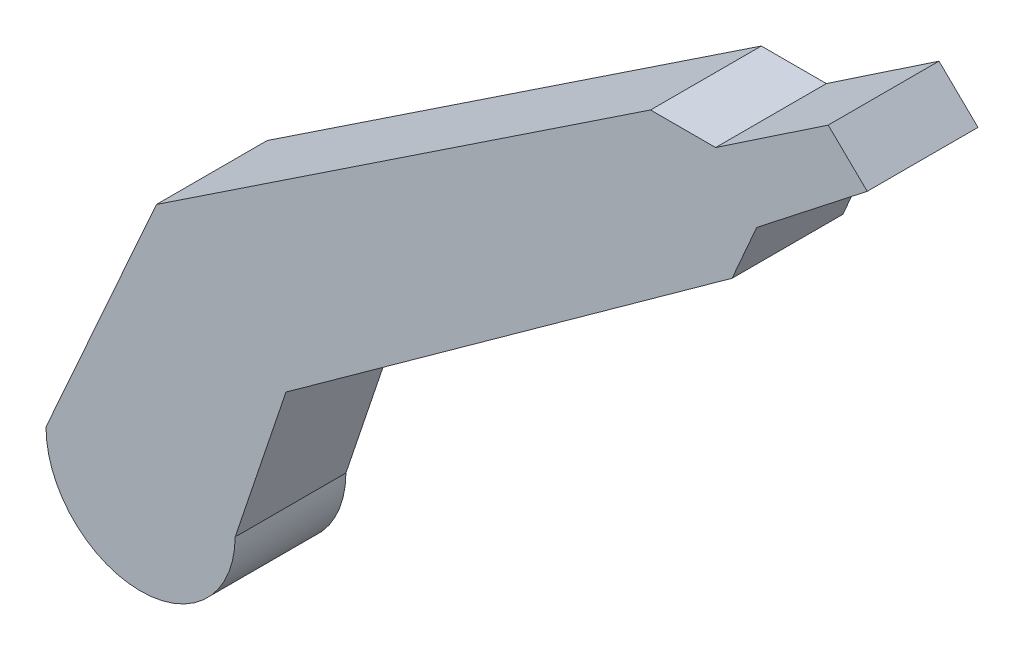
ISO-10303-21;
HEADER;
FILE_DESCRIPTION(('STEP AP214'),'2;1');
FILE_NAME('part.step','',(''),(''),'','','');
FILE_SCHEMA(('AUTOMOTIVE_DESIGN { 1 0 10303 214 1 1 1 1 }'));
ENDSEC;
DATA;
#1=APPLICATION_CONTEXT('core data for automotive mechanical design processes');
#2=APPLICATION_PROTOCOL_DEFINITION('international standard','automotive_design',2000,#1);
#3=PRODUCT_CONTEXT('',#1,'mechanical');
#4=PRODUCT('Part','Part','',(#3));
#5=PRODUCT_RELATED_PRODUCT_CATEGORY('part','',(#4));
#6=PRODUCT_DEFINITION_FORMATION('','',#4);
#7=PRODUCT_DEFINITION_CONTEXT('part definition',#1,'design');
#8=PRODUCT_DEFINITION('design','',#6,#7);
#9=PRODUCT_DEFINITION_SHAPE('','',#8);
#10=(LENGTH_UNIT() NAMED_UNIT(*) SI_UNIT(.MILLI.,.METRE.));
#11=(NAMED_UNIT(*) PLANE_ANGLE_UNIT() SI_UNIT($,.RADIAN.));
#12=(NAMED_UNIT(*) SI_UNIT($,.STERADIAN.) SOLID_ANGLE_UNIT());
#13=UNCERTAINTY_MEASURE_WITH_UNIT(LENGTH_MEASURE(1.E-05),#10,'distance_accuracy_value','');
#14=(GEOMETRIC_REPRESENTATION_CONTEXT(3) GLOBAL_UNCERTAINTY_ASSIGNED_CONTEXT((#13)) GLOBAL_UNIT_ASSIGNED_CONTEXT((#10,
#11,#12)) REPRESENTATION_CONTEXT('',''));
#15=CARTESIAN_POINT('',(0.,0.,0.));
#16=DIRECTION('',(0.,0.,1.));
#17=DIRECTION('',(1.,0.,0.));
#18=AXIS2_PLACEMENT_3D('',#15,#16,#17);
#19=CARTESIAN_POINT('',(-4.96700439876463,8.83577647212519,-15.));
#20=DIRECTION('',(0.,1.,0.));
#21=DIRECTION('',(0.,0.,1.));
#22=AXIS2_PLACEMENT_3D('',#19,#20,#21);
#23=PLANE('',#22);
#24=DIRECTION('',(-1.,0.,0.));
#25=VECTOR('',#24,1.);
#26=CARTESIAN_POINT('',(-4.96700439876463,8.83577647212519,0.));
#27=LINE('',#26,#25);
#28=CARTESIAN_POINT('',(3.84495684434683,8.83577647212519,0.));
#29=VERTEX_POINT('',#28);
#30=CARTESIAN_POINT('',(-4.96700439876463,8.83577647212519,0.));
#31=VERTEX_POINT('',#30);
#32=EDGE_CURVE('E160',#29,#31,#27,.T.);
#33=ORIENTED_EDGE('',*,*,#32,.F.);
#34=DIRECTION('',(0.,0.,1.));
#35=VECTOR('',#34,1.);
#36=CARTESIAN_POINT('',(3.84495684434683,8.83577647212519,-15.));
#37=LINE('',#36,#35);
#38=CARTESIAN_POINT('',(3.84495684434683,8.83577647212519,-15.));
#39=VERTEX_POINT('',#38);
#40=EDGE_CURVE('E11',#39,#29,#37,.T.);
#41=ORIENTED_EDGE('',*,*,#40,.F.);
#42=DIRECTION('',(-1.,0.,0.));
#43=VECTOR('',#42,1.);
#44=CARTESIAN_POINT('',(-4.96700439876463,8.83577647212519,-15.));
#45=LINE('',#44,#43);
#46=CARTESIAN_POINT('',(-4.96700439876463,8.83577647212519,-15.));
#47=VERTEX_POINT('',#46);
#48=EDGE_CURVE('E196',#39,#47,#45,.T.);
#49=ORIENTED_EDGE('',*,*,#48,.T.);
#50=DIRECTION('',(0.,0.,1.));
#51=VECTOR('',#50,1.);
#52=CARTESIAN_POINT('',(-4.96700439876463,8.83577647212519,-15.));
#53=LINE('',#52,#51);
#54=EDGE_CURVE('E48',#47,#31,#53,.T.);
#55=ORIENTED_EDGE('',*,*,#54,.T.);
#56=EDGE_LOOP('',(#33,#41,#49,#55));
#57=FACE_BOUND('',#56,.T.);
#58=ADVANCED_FACE('F45',(#57),#23,.T.);
#59=CARTESIAN_POINT('',(3.84495684434683,8.83577647212519,-15.));
#60=DIRECTION('',(-0.558142355295475,0.829745208618417,0.));
#61=DIRECTION('',(-0.829745208618417,-0.558142355295475,0.));
#62=AXIS2_PLACEMENT_3D('',#59,#60,#61);
#63=PLANE('',#62);
#64=DIRECTION('',(-0.829745208618417,-0.558142355295475,0.));
#65=VECTOR('',#64,1.);
#66=CARTESIAN_POINT('',(3.84495684434683,8.83577647212519,0.));
#67=LINE('',#66,#65);
#68=CARTESIAN_POINT('',(19.0918830920997,19.0918830920198,0.));
#69=VERTEX_POINT('',#68);
#70=EDGE_CURVE('E193',#69,#29,#67,.T.);
#71=ORIENTED_EDGE('',*,*,#70,.F.);
#72=DIRECTION('',(0.,0.,1.));
#73=VECTOR('',#72,1.);
#74=CARTESIAN_POINT('',(19.0918830920997,19.0918830920198,-15.));
#75=LINE('',#74,#73);
#76=CARTESIAN_POINT('',(19.0918830920997,19.0918830920198,-15.));
#77=VERTEX_POINT('',#76);
#78=EDGE_CURVE('E55',#77,#69,#75,.T.);
#79=ORIENTED_EDGE('',*,*,#78,.F.);
#80=DIRECTION('',(-0.829745208618417,-0.558142355295475,0.));
#81=VECTOR('',#80,1.);
#82=CARTESIAN_POINT('',(3.84495684434683,8.83577647212519,-15.));
#83=LINE('',#82,#81);
#84=EDGE_CURVE('E146',#77,#39,#83,.T.);
#85=ORIENTED_EDGE('',*,*,#84,.T.);
#86=ORIENTED_EDGE('',*,*,#40,.T.);
#87=EDGE_LOOP('',(#71,#79,#85,#86));
#88=FACE_BOUND('',#87,.T.);
#89=ADVANCED_FACE('F220',(#88),#63,.T.);
#90=CARTESIAN_POINT('',(19.0918830920997,19.0918830920198,-15.));
#91=DIRECTION('',(0.696355952916094,0.717696584106626,0.));
#92=DIRECTION('',(-0.717696584106626,0.696355952916094,0.));
#93=AXIS2_PLACEMENT_3D('',#90,#91,#92);
#94=PLANE('',#93);
#95=DIRECTION('',(-0.717696584106626,0.696355952916094,0.));
#96=VECTOR('',#95,1.);
#97=CARTESIAN_POINT('',(19.0918830920997,19.0918830920198,0.));
#98=LINE('',#97,#96);
#99=CARTESIAN_POINT('',(24.3770915092227,13.9638297820725,0.));
#100=VERTEX_POINT('',#99);
#101=EDGE_CURVE('E132',#100,#69,#98,.T.);
#102=ORIENTED_EDGE('',*,*,#101,.F.);
#103=DIRECTION('',(0.,0.,1.));
#104=VECTOR('',#103,1.);
#105=CARTESIAN_POINT('',(24.3770915092227,13.9638297820725,-15.));
#106=LINE('',#105,#104);
#107=CARTESIAN_POINT('',(24.3770915092227,13.9638297820725,-15.));
#108=VERTEX_POINT('',#107);
#109=EDGE_CURVE('E127',#108,#100,#106,.T.);
#110=ORIENTED_EDGE('',*,*,#109,.F.);
#111=DIRECTION('',(-0.717696584106626,0.696355952916094,0.));
#112=VECTOR('',#111,1.);
#113=CARTESIAN_POINT('',(19.0918830920997,19.0918830920198,-15.));
#114=LINE('',#113,#112);
#115=EDGE_CURVE('E130',#108,#77,#114,.T.);
#116=ORIENTED_EDGE('',*,*,#115,.T.);
#117=ORIENTED_EDGE('',*,*,#78,.T.);
#118=EDGE_LOOP('',(#102,#110,#116,#117));
#119=FACE_BOUND('',#118,.T.);
#120=ADVANCED_FACE('F129',(#119),#94,.T.);
#121=CARTESIAN_POINT('',(24.3770915092227,13.9638297820725,-15.));
#122=DIRECTION('',(0.616422868203892,-0.787415295479639,0.));
#123=DIRECTION('',(0.787415295479639,0.616422868203892,0.));
#124=AXIS2_PLACEMENT_3D('',#121,#122,#123);
#125=PLANE('',#124);
#126=DIRECTION('',(0.787415295479639,0.616422868203892,0.));
#127=VECTOR('',#126,1.);
#128=CARTESIAN_POINT('',(24.3770915092227,13.9638297820725,0.));
#129=LINE('',#128,#127);
#130=CARTESIAN_POINT('',(9.4079892103025,2.24536682293319,0.));
#131=VERTEX_POINT('',#130);
#132=EDGE_CURVE('E188',#131,#100,#129,.T.);
#133=ORIENTED_EDGE('',*,*,#132,.F.);
#134=DIRECTION('',(0.,0.,1.));
#135=VECTOR('',#134,1.);
#136=CARTESIAN_POINT('',(9.4079892103025,2.24536682293319,-15.));
#137=LINE('',#136,#135);
#138=CARTESIAN_POINT('',(9.4079892103025,2.24536682293319,-15.));
#139=VERTEX_POINT('',#138);
#140=EDGE_CURVE('E138',#139,#131,#137,.T.);
#141=ORIENTED_EDGE('',*,*,#140,.F.);
#142=DIRECTION('',(0.787415295479639,0.616422868203892,0.));
#143=VECTOR('',#142,1.);
#144=CARTESIAN_POINT('',(24.3770915092227,13.9638297820725,-15.));
#145=LINE('',#144,#143);
#146=EDGE_CURVE('E144',#139,#108,#145,.T.);
#147=ORIENTED_EDGE('',*,*,#146,.T.);
#148=ORIENTED_EDGE('',*,*,#109,.T.);
#149=EDGE_LOOP('',(#133,#141,#147,#148));
#150=FACE_BOUND('',#149,.T.);
#151=ADVANCED_FACE('F149',(#150),#125,.T.);
#152=CARTESIAN_POINT('',(9.4079892103025,2.24536682293319,-15.));
#153=DIRECTION('',(0.916458991132979,-0.400128626283502,0.));
#154=DIRECTION('',(0.400128626283502,0.916458991132979,0.));
#155=AXIS2_PLACEMENT_3D('',#152,#153,#154);
#156=PLANE('',#155);
#157=DIRECTION('',(0.400128626283502,0.916458991132979,0.));
#158=VECTOR('',#157,1.);
#159=CARTESIAN_POINT('',(9.4079892103025,2.24536682293319,0.));
#160=LINE('',#159,#158);
#161=CARTESIAN_POINT('',(6.0777600064057,-5.38222664567911,0.));
#162=VERTEX_POINT('',#161);
#163=EDGE_CURVE('E184',#162,#131,#160,.T.);
#164=ORIENTED_EDGE('',*,*,#163,.F.);
#165=DIRECTION('',(0.,0.,1.));
#166=VECTOR('',#165,1.);
#167=CARTESIAN_POINT('',(6.0777600064057,-5.38222664567911,-15.));
#168=LINE('',#167,#166);
#169=CARTESIAN_POINT('',(6.0777600064057,-5.38222664567911,-15.));
#170=VERTEX_POINT('',#169);
#171=EDGE_CURVE('E202',#170,#162,#168,.T.);
#172=ORIENTED_EDGE('',*,*,#171,.F.);
#173=DIRECTION('',(0.400128626283502,0.916458991132979,0.));
#174=VECTOR('',#173,1.);
#175=CARTESIAN_POINT('',(9.4079892103025,2.24536682293319,-15.));
#176=LINE('',#175,#174);
#177=EDGE_CURVE('E151',#170,#139,#176,.T.);
#178=ORIENTED_EDGE('',*,*,#177,.T.);
#179=ORIENTED_EDGE('',*,*,#140,.T.);
#180=EDGE_LOOP('',(#164,#172,#178,#179));
#181=FACE_BOUND('',#180,.T.);
#182=ADVANCED_FACE('F233',(#181),#156,.T.);
#183=CARTESIAN_POINT('',(6.0777600064057,-5.38222664567911,-15.));
#184=DIRECTION('',(0.584776246688422,-0.811194638363076,0.));
#185=DIRECTION('',(0.811194638363076,0.584776246688422,0.));
#186=AXIS2_PLACEMENT_3D('',#183,#184,#185);
#187=PLANE('',#186);
#188=DIRECTION('',(0.811194638363076,0.584776246688422,0.));
#189=VECTOR('',#188,1.);
#190=CARTESIAN_POINT('',(6.0777600064057,-5.38222664567911,0.));
#191=LINE('',#190,#189);
#192=CARTESIAN_POINT('',(-54.3403592021819,-48.9366084326035,0.));
#193=VERTEX_POINT('',#192);
#194=EDGE_CURVE('E180',#193,#162,#191,.T.);
#195=ORIENTED_EDGE('',*,*,#194,.F.);
#196=DIRECTION('',(0.,0.,1.));
#197=VECTOR('',#196,1.);
#198=CARTESIAN_POINT('',(-54.3403592021819,-48.9366084326035,-15.));
#199=LINE('',#198,#197);
#200=CARTESIAN_POINT('',(-54.3403592021819,-48.9366084326035,-15.));
#201=VERTEX_POINT('',#200);
#202=EDGE_CURVE('E205',#201,#193,#199,.T.);
#203=ORIENTED_EDGE('',*,*,#202,.F.);
#204=DIRECTION('',(0.811194638363076,0.584776246688422,0.));
#205=VECTOR('',#204,1.);
#206=CARTESIAN_POINT('',(6.0777600064057,-5.38222664567911,-15.));
#207=LINE('',#206,#205);
#208=EDGE_CURVE('E154',#201,#170,#207,.T.);
#209=ORIENTED_EDGE('',*,*,#208,.T.);
#210=ORIENTED_EDGE('',*,*,#171,.T.);
#211=EDGE_LOOP('',(#195,#203,#209,#210));
#212=FACE_BOUND('',#211,.T.);
#213=ADVANCED_FACE('F236',(#212),#187,.T.);
#214=CARTESIAN_POINT('',(-54.3403592021819,-48.9366084326035,-15.));
#215=DIRECTION('',(0.947729391455497,-0.319075227135221,0.));
#216=DIRECTION('',(0.319075227135221,0.947729391455497,0.));
#217=AXIS2_PLACEMENT_3D('',#214,#215,#216);
#218=PLANE('',#217);
#219=DIRECTION('',(0.319075227135221,0.947729391455497,0.));
#220=VECTOR('',#219,1.);
#221=CARTESIAN_POINT('',(-54.3403592021819,-48.9366084326035,0.));
#222=LINE('',#221,#220);
#223=CARTESIAN_POINT('',(-61.2186472889356,-69.3667616639981,0.));
#224=VERTEX_POINT('',#223);
#225=EDGE_CURVE('E176',#224,#193,#222,.T.);
#226=ORIENTED_EDGE('',*,*,#225,.F.);
#227=DIRECTION('',(0.,0.,1.));
#228=VECTOR('',#227,1.);
#229=CARTESIAN_POINT('',(-61.2186472889356,-69.3667616639981,-15.));
#230=LINE('',#229,#228);
#231=CARTESIAN_POINT('',(-61.2186472889356,-69.3667616639981,-15.));
#232=VERTEX_POINT('',#231);
#233=EDGE_CURVE('E208',#232,#224,#230,.T.);
#234=ORIENTED_EDGE('',*,*,#233,.F.);
#235=DIRECTION('',(0.319075227135221,0.947729391455497,0.));
#236=VECTOR('',#235,1.);
#237=CARTESIAN_POINT('',(-54.3403592021819,-48.9366084326035,-15.));
#238=LINE('',#237,#236);
#239=EDGE_CURVE('E335',#232,#201,#238,.T.);
#240=ORIENTED_EDGE('',*,*,#239,.T.);
#241=ORIENTED_EDGE('',*,*,#202,.T.);
#242=EDGE_LOOP('',(#226,#234,#240,#241));
#243=FACE_BOUND('',#242,.T.);
#244=ADVANCED_FACE('F240',(#243),#218,.T.);
#245=CARTESIAN_POINT('',(-74.0261196075807,-69.3140261854595,-15.));
#246=DIRECTION('',(0.,0.,1.));
#247=DIRECTION('',(1.,0.,0.));
#248=AXIS2_PLACEMENT_3D('',#245,#246,#247);
#249=CYLINDRICAL_SURFACE('',#248,12.8075808888157);
#250=CARTESIAN_POINT('',(-74.0261196075807,-69.3140261854595,0.));
#251=DIRECTION('',(0.,0.,1.));
#252=DIRECTION('',(1.,0.,0.));
#253=AXIS2_PLACEMENT_3D('',#250,#251,#252);
#254=CIRCLE('',#253,12.8075808888157);
#255=CARTESIAN_POINT('',(-86.8335919262258,-69.2612907069208,0.));
#256=VERTEX_POINT('',#255);
#257=EDGE_CURVE('E172',#256,#224,#254,.T.);
#258=ORIENTED_EDGE('',*,*,#257,.F.);
#259=DIRECTION('',(0.,0.,1.));
#260=VECTOR('',#259,1.);
#261=CARTESIAN_POINT('',(-86.8335919262258,-69.2612907069208,-15.));
#262=LINE('',#261,#260);
#263=CARTESIAN_POINT('',(-86.8335919262258,-69.2612907069208,-15.));
#264=VERTEX_POINT('',#263);
#265=EDGE_CURVE('E211',#264,#256,#262,.T.);
#266=ORIENTED_EDGE('',*,*,#265,.F.);
#267=CARTESIAN_POINT('',(-74.0261196075807,-69.3140261854595,-15.));
#268=DIRECTION('',(0.,0.,1.));
#269=DIRECTION('',(1.,0.,0.));
#270=AXIS2_PLACEMENT_3D('',#267,#268,#269);
#271=CIRCLE('',#270,12.8075808888157);
#272=EDGE_CURVE('E331',#264,#232,#271,.T.);
#273=ORIENTED_EDGE('',*,*,#272,.T.);
#274=ORIENTED_EDGE('',*,*,#233,.T.);
#275=EDGE_LOOP('',(#258,#266,#273,#274));
#276=FACE_BOUND('',#275,.T.);
#277=ADVANCED_FACE('F244',(#276),#249,.T.);
#278=CARTESIAN_POINT('',(-71.8849520293432,-35.7071985875734,-15.));
#279=DIRECTION('',(-0.913450392722276,0.406950095264173,0.));
#280=DIRECTION('',(-0.406950095264173,-0.913450392722276,0.));
#281=AXIS2_PLACEMENT_3D('',#278,#279,#280);
#282=PLANE('',#281);
#283=DIRECTION('',(-0.406950095264173,-0.913450392722276,0.));
#284=VECTOR('',#283,1.);
#285=CARTESIAN_POINT('',(-71.8849520293432,-35.7071985875734,0.));
#286=LINE('',#285,#284);
#287=CARTESIAN_POINT('',(-71.8849520293432,-35.7071985875734,0.));
#288=VERTEX_POINT('',#287);
#289=EDGE_CURVE('E168',#288,#256,#286,.T.);
#290=ORIENTED_EDGE('',*,*,#289,.F.);
#291=DIRECTION('',(0.,0.,1.));
#292=VECTOR('',#291,1.);
#293=CARTESIAN_POINT('',(-71.8849520293432,-35.7071985875734,-15.));
#294=LINE('',#293,#292);
#295=CARTESIAN_POINT('',(-71.8849520293432,-35.7071985875734,-15.));
#296=VERTEX_POINT('',#295);
#297=EDGE_CURVE('E213',#296,#288,#294,.T.);
#298=ORIENTED_EDGE('',*,*,#297,.F.);
#299=DIRECTION('',(-0.406950095264173,-0.913450392722276,0.));
#300=VECTOR('',#299,1.);
#301=CARTESIAN_POINT('',(-71.8849520293432,-35.7071985875734,-15.));
#302=LINE('',#301,#300);
#303=EDGE_CURVE('E345',#296,#264,#302,.T.);
#304=ORIENTED_EDGE('',*,*,#303,.T.);
#305=ORIENTED_EDGE('',*,*,#265,.T.);
#306=EDGE_LOOP('',(#290,#298,#304,#305));
#307=FACE_BOUND('',#306,.T.);
#308=ADVANCED_FACE('F248',(#307),#282,.T.);
#309=CARTESIAN_POINT('',(-4.96700439876463,8.83577647212519,-15.));
#310=DIRECTION('',(-0.554105900794991,0.832446184869732,0.));
#311=DIRECTION('',(-0.832446184869732,-0.554105900794991,0.));
#312=AXIS2_PLACEMENT_3D('',#309,#310,#311);
#313=PLANE('',#312);
#314=DIRECTION('',(-0.832446184869732,-0.554105900794991,0.));
#315=VECTOR('',#314,1.);
#316=CARTESIAN_POINT('',(-4.96700439876463,8.83577647212519,0.));
#317=LINE('',#316,#315);
#318=EDGE_CURVE('E164',#31,#288,#317,.T.);
#319=ORIENTED_EDGE('',*,*,#318,.F.);
#320=ORIENTED_EDGE('',*,*,#54,.F.);
#321=DIRECTION('',(-0.832446184869732,-0.554105900794991,0.));
#322=VECTOR('',#321,1.);
#323=CARTESIAN_POINT('',(-4.96700439876463,8.83577647212519,-15.));
#324=LINE('',#323,#322);
#325=EDGE_CURVE('E348',#47,#296,#324,.T.);
#326=ORIENTED_EDGE('',*,*,#325,.T.);
#327=ORIENTED_EDGE('',*,*,#297,.T.);
#328=EDGE_LOOP('',(#319,#320,#326,#327));
#329=FACE_BOUND('',#328,.T.);
#330=ADVANCED_FACE('F217',(#329),#313,.T.);
#331=CARTESIAN_POINT('',(-74.0261196075807,-69.3140261854595,-15.));
#332=DIRECTION('',(0.,0.,1.));
#333=DIRECTION('',(1.,0.,0.));
#334=AXIS2_PLACEMENT_3D('',#331,#332,#333);
#335=PLANE('',#334);
#336=ORIENTED_EDGE('',*,*,#48,.F.);
#337=ORIENTED_EDGE('',*,*,#84,.F.);
#338=ORIENTED_EDGE('',*,*,#115,.F.);
#339=ORIENTED_EDGE('',*,*,#146,.F.);
#340=ORIENTED_EDGE('',*,*,#177,.F.);
#341=ORIENTED_EDGE('',*,*,#208,.F.);
#342=ORIENTED_EDGE('',*,*,#239,.F.);
#343=ORIENTED_EDGE('',*,*,#272,.F.);
#344=ORIENTED_EDGE('',*,*,#303,.F.);
#345=ORIENTED_EDGE('',*,*,#325,.F.);
#346=EDGE_LOOP('',(#336,#337,#338,#339,#340,#341,#342,#343,#344,#345));
#347=FACE_BOUND('',#346,.T.);
#348=ADVANCED_FACE('F142',(#347),#335,.F.);
#349=CARTESIAN_POINT('',(-74.0261196075807,-69.3140261854595,0.));
#350=DIRECTION('',(0.,0.,1.));
#351=DIRECTION('',(1.,0.,0.));
#352=AXIS2_PLACEMENT_3D('',#349,#350,#351);
#353=PLANE('',#352);
#354=ORIENTED_EDGE('',*,*,#32,.T.);
#355=ORIENTED_EDGE('',*,*,#318,.T.);
#356=ORIENTED_EDGE('',*,*,#289,.T.);
#357=ORIENTED_EDGE('',*,*,#257,.T.);
#358=ORIENTED_EDGE('',*,*,#225,.T.);
#359=ORIENTED_EDGE('',*,*,#194,.T.);
#360=ORIENTED_EDGE('',*,*,#163,.T.);
#361=ORIENTED_EDGE('',*,*,#132,.T.);
#362=ORIENTED_EDGE('',*,*,#101,.T.);
#363=ORIENTED_EDGE('',*,*,#70,.T.);
#364=EDGE_LOOP('',(#354,#355,#356,#357,#358,#359,#360,#361,#362,#363));
#365=FACE_BOUND('',#364,.T.);
#366=ADVANCED_FACE('F219',(#365),#353,.T.);
#367=CLOSED_SHELL('',(#58,#89,#120,#151,#182,#213,#244,#277,#308,#330,#348,#366));
#368=MANIFOLD_SOLID_BREP('B2',#367);
#369=ADVANCED_BREP_SHAPE_REPRESENTATION('',(#18,#368),#14);
#370=SHAPE_DEFINITION_REPRESENTATION(#9,#369);
ENDSEC;
END-ISO-10303-21;
